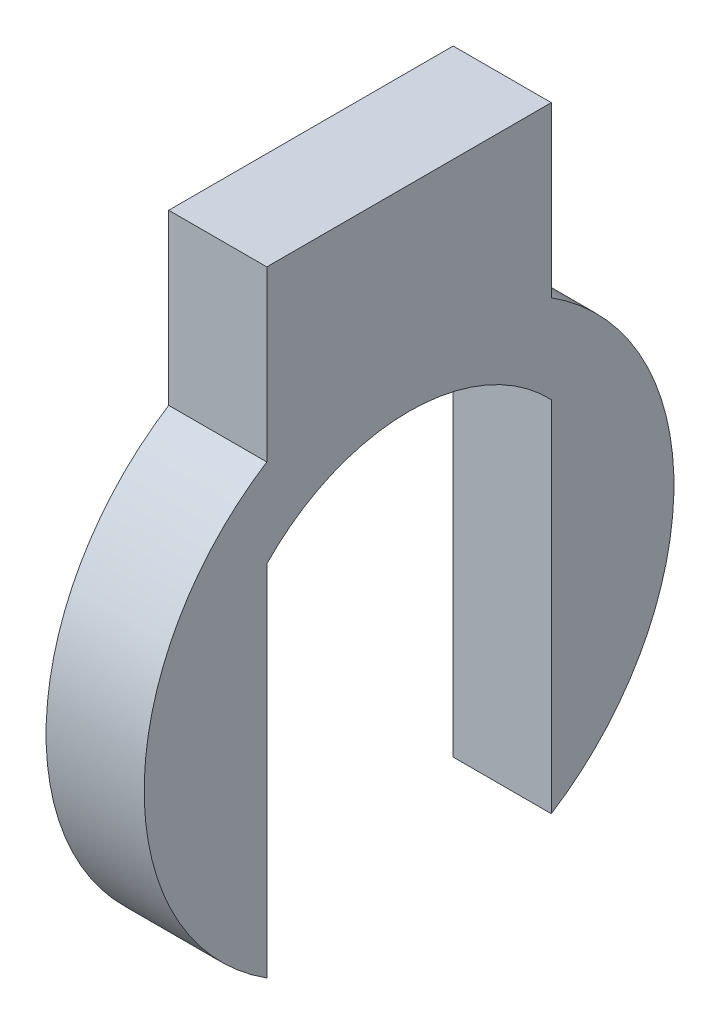
ISO-10303-21;
HEADER;
FILE_DESCRIPTION(('STEP AP214'),'2;1');
FILE_NAME('part.step','',(''),(''),'','','');
FILE_SCHEMA(('AUTOMOTIVE_DESIGN { 1 0 10303 214 1 1 1 1 }'));
ENDSEC;
DATA;
#1=APPLICATION_CONTEXT('core data for automotive mechanical design processes');
#2=APPLICATION_PROTOCOL_DEFINITION('international standard','automotive_design',2000,#1);
#3=PRODUCT_CONTEXT('',#1,'mechanical');
#4=PRODUCT('Part','Part','',(#3));
#5=PRODUCT_RELATED_PRODUCT_CATEGORY('part','',(#4));
#6=PRODUCT_DEFINITION_FORMATION('','',#4);
#7=PRODUCT_DEFINITION_CONTEXT('part definition',#1,'design');
#8=PRODUCT_DEFINITION('design','',#6,#7);
#9=PRODUCT_DEFINITION_SHAPE('','',#8);
#10=(LENGTH_UNIT() NAMED_UNIT(*) SI_UNIT(.MILLI.,.METRE.));
#11=(NAMED_UNIT(*) PLANE_ANGLE_UNIT() SI_UNIT($,.RADIAN.));
#12=(NAMED_UNIT(*) SI_UNIT($,.STERADIAN.) SOLID_ANGLE_UNIT());
#13=UNCERTAINTY_MEASURE_WITH_UNIT(LENGTH_MEASURE(1.E-05),#10,'distance_accuracy_value','');
#14=(GEOMETRIC_REPRESENTATION_CONTEXT(3) GLOBAL_UNCERTAINTY_ASSIGNED_CONTEXT((#13)) GLOBAL_UNIT_ASSIGNED_CONTEXT((#10,
#11,#12)) REPRESENTATION_CONTEXT('',''));
#15=CARTESIAN_POINT('',(0.,0.,0.));
#16=DIRECTION('',(0.,0.,1.));
#17=DIRECTION('',(1.,0.,0.));
#18=AXIS2_PLACEMENT_3D('',#15,#16,#17);
#19=CARTESIAN_POINT('',(2.54,0.,3.683));
#20=DIRECTION('',(0.,0.,1.));
#21=DIRECTION('',(1.,0.,0.));
#22=AXIS2_PLACEMENT_3D('',#19,#20,#21);
#23=PLANE('',#22);
#24=DIRECTION('',(0.,1.,0.));
#25=VECTOR('',#24,1.);
#26=CARTESIAN_POINT('',(0.,0.,3.683));
#27=LINE('',#26,#25);
#28=CARTESIAN_POINT('',(0.,-5.78512532275663,3.683));
#29=VERTEX_POINT('',#28);
#30=CARTESIAN_POINT('',(0.,3.4988442377448,3.683));
#31=VERTEX_POINT('',#30);
#32=EDGE_CURVE('E145',#29,#31,#27,.T.);
#33=ORIENTED_EDGE('',*,*,#32,.T.);
#34=DIRECTION('',(-1.,0.,0.));
#35=VECTOR('',#34,1.);
#36=CARTESIAN_POINT('',(2.54,3.4988442377448,3.683));
#37=LINE('',#36,#35);
#38=CARTESIAN_POINT('',(2.54,3.4988442377448,3.683));
#39=VERTEX_POINT('',#38);
#40=EDGE_CURVE('E11',#39,#31,#37,.T.);
#41=ORIENTED_EDGE('',*,*,#40,.F.);
#42=DIRECTION('',(0.,1.,0.));
#43=VECTOR('',#42,1.);
#44=CARTESIAN_POINT('',(2.54,0.,3.683));
#45=LINE('',#44,#43);
#46=CARTESIAN_POINT('',(2.54,-5.78512532275663,3.683));
#47=VERTEX_POINT('',#46);
#48=EDGE_CURVE('E100',#47,#39,#45,.T.);
#49=ORIENTED_EDGE('',*,*,#48,.F.);
#50=DIRECTION('',(-1.,0.,0.));
#51=VECTOR('',#50,1.);
#52=CARTESIAN_POINT('',(2.54,-5.78512532275663,3.683));
#53=LINE('',#52,#51);
#54=EDGE_CURVE('E141',#47,#29,#53,.T.);
#55=ORIENTED_EDGE('',*,*,#54,.T.);
#56=EDGE_LOOP('',(#33,#41,#49,#55));
#57=FACE_BOUND('',#56,.T.);
#58=ADVANCED_FACE('F47',(#57),#23,.F.);
#59=CARTESIAN_POINT('',(2.54,0.,0.));
#60=DIRECTION('',(-1.,0.,0.));
#61=DIRECTION('',(0.,0.,1.));
#62=AXIS2_PLACEMENT_3D('',#59,#60,#61);
#63=CYLINDRICAL_SURFACE('',#62,5.08);
#64=CARTESIAN_POINT('',(0.,0.,0.));
#65=DIRECTION('',(1.,0.,0.));
#66=DIRECTION('',(0.,0.,-1.));
#67=AXIS2_PLACEMENT_3D('',#64,#65,#66);
#68=CIRCLE('',#67,5.08);
#69=CARTESIAN_POINT('',(0.,3.4988442377448,-3.683));
#70=VERTEX_POINT('',#69);
#71=EDGE_CURVE('E149',#70,#31,#68,.T.);
#72=ORIENTED_EDGE('',*,*,#71,.F.);
#73=DIRECTION('',(-1.,0.,0.));
#74=VECTOR('',#73,1.);
#75=CARTESIAN_POINT('',(2.54,3.4988442377448,-3.683));
#76=LINE('',#75,#74);
#77=CARTESIAN_POINT('',(2.54,3.4988442377448,-3.683));
#78=VERTEX_POINT('',#77);
#79=EDGE_CURVE('E56',#78,#70,#76,.T.);
#80=ORIENTED_EDGE('',*,*,#79,.F.);
#81=CARTESIAN_POINT('',(2.54,0.,0.));
#82=DIRECTION('',(1.,0.,0.));
#83=DIRECTION('',(0.,0.,-1.));
#84=AXIS2_PLACEMENT_3D('',#81,#82,#83);
#85=CIRCLE('',#84,5.08);
#86=EDGE_CURVE('E212',#78,#39,#85,.T.);
#87=ORIENTED_EDGE('',*,*,#86,.T.);
#88=ORIENTED_EDGE('',*,*,#40,.T.);
#89=EDGE_LOOP('',(#72,#80,#87,#88));
#90=FACE_BOUND('',#89,.T.);
#91=ADVANCED_FACE('F193',(#90),#63,.F.);
#92=CARTESIAN_POINT('',(2.54,0.,-3.683));
#93=DIRECTION('',(0.,0.,1.));
#94=DIRECTION('',(1.,0.,0.));
#95=AXIS2_PLACEMENT_3D('',#92,#93,#94);
#96=PLANE('',#95);
#97=DIRECTION('',(0.,1.,0.));
#98=VECTOR('',#97,1.);
#99=CARTESIAN_POINT('',(0.,0.,-3.683));
#100=LINE('',#99,#98);
#101=CARTESIAN_POINT('',(0.,-5.78512532275663,-3.683));
#102=VERTEX_POINT('',#101);
#103=EDGE_CURVE('E153',#102,#70,#100,.T.);
#104=ORIENTED_EDGE('',*,*,#103,.F.);
#105=DIRECTION('',(-1.,0.,0.));
#106=VECTOR('',#105,1.);
#107=CARTESIAN_POINT('',(2.54,-5.78512532275663,-3.683));
#108=LINE('',#107,#106);
#109=CARTESIAN_POINT('',(2.54,-5.78512532275663,-3.683));
#110=VERTEX_POINT('',#109);
#111=EDGE_CURVE('E181',#110,#102,#108,.T.);
#112=ORIENTED_EDGE('',*,*,#111,.F.);
#113=DIRECTION('',(0.,1.,0.));
#114=VECTOR('',#113,1.);
#115=CARTESIAN_POINT('',(2.54,0.,-3.683));
#116=LINE('',#115,#114);
#117=EDGE_CURVE('E190',#110,#78,#116,.T.);
#118=ORIENTED_EDGE('',*,*,#117,.T.);
#119=ORIENTED_EDGE('',*,*,#79,.T.);
#120=EDGE_LOOP('',(#104,#112,#118,#119));
#121=FACE_BOUND('',#120,.T.);
#122=ADVANCED_FACE('F188',(#121),#96,.T.);
#123=CARTESIAN_POINT('',(2.54,0.,0.));
#124=DIRECTION('',(-1.,0.,0.));
#125=DIRECTION('',(0.,0.,1.));
#126=AXIS2_PLACEMENT_3D('',#123,#124,#125);
#127=CYLINDRICAL_SURFACE('',#126,6.858);
#128=CARTESIAN_POINT('',(0.,0.,0.));
#129=DIRECTION('',(1.,0.,0.));
#130=DIRECTION('',(0.,0.,-1.));
#131=AXIS2_PLACEMENT_3D('',#128,#129,#130);
#132=CIRCLE('',#131,6.858);
#133=CARTESIAN_POINT('',(0.,5.78512532275663,-3.683));
#134=VERTEX_POINT('',#133);
#135=EDGE_CURVE('E157',#102,#134,#132,.T.);
#136=ORIENTED_EDGE('',*,*,#135,.T.);
#137=DIRECTION('',(-1.,0.,0.));
#138=VECTOR('',#137,1.);
#139=CARTESIAN_POINT('',(2.54,5.78512532275663,-3.683));
#140=LINE('',#139,#138);
#141=CARTESIAN_POINT('',(2.54,5.78512532275663,-3.683));
#142=VERTEX_POINT('',#141);
#143=EDGE_CURVE('E177',#142,#134,#140,.T.);
#144=ORIENTED_EDGE('',*,*,#143,.F.);
#145=CARTESIAN_POINT('',(2.54,0.,0.));
#146=DIRECTION('',(1.,0.,0.));
#147=DIRECTION('',(0.,0.,-1.));
#148=AXIS2_PLACEMENT_3D('',#145,#146,#147);
#149=CIRCLE('',#148,6.858);
#150=EDGE_CURVE('E206',#110,#142,#149,.T.);
#151=ORIENTED_EDGE('',*,*,#150,.F.);
#152=ORIENTED_EDGE('',*,*,#111,.T.);
#153=EDGE_LOOP('',(#136,#144,#151,#152));
#154=FACE_BOUND('',#153,.T.);
#155=ADVANCED_FACE('F201',(#154),#127,.T.);
#156=CARTESIAN_POINT('',(2.54,0.,-3.683));
#157=DIRECTION('',(0.,0.,1.));
#158=DIRECTION('',(1.,0.,0.));
#159=AXIS2_PLACEMENT_3D('',#156,#157,#158);
#160=PLANE('',#159);
#161=DIRECTION('',(0.,1.,0.));
#162=VECTOR('',#161,1.);
#163=CARTESIAN_POINT('',(0.,0.,-3.683));
#164=LINE('',#163,#162);
#165=CARTESIAN_POINT('',(0.,10.16,-3.683));
#166=VERTEX_POINT('',#165);
#167=EDGE_CURVE('E160',#134,#166,#164,.T.);
#168=ORIENTED_EDGE('',*,*,#167,.T.);
#169=DIRECTION('',(-1.,0.,0.));
#170=VECTOR('',#169,1.);
#171=CARTESIAN_POINT('',(2.54,10.16,-3.683));
#172=LINE('',#171,#170);
#173=CARTESIAN_POINT('',(2.54,10.16,-3.683));
#174=VERTEX_POINT('',#173);
#175=EDGE_CURVE('E128',#174,#166,#172,.T.);
#176=ORIENTED_EDGE('',*,*,#175,.F.);
#177=DIRECTION('',(0.,1.,0.));
#178=VECTOR('',#177,1.);
#179=CARTESIAN_POINT('',(2.54,0.,-3.683));
#180=LINE('',#179,#178);
#181=EDGE_CURVE('E133',#142,#174,#180,.T.);
#182=ORIENTED_EDGE('',*,*,#181,.F.);
#183=ORIENTED_EDGE('',*,*,#143,.T.);
#184=EDGE_LOOP('',(#168,#176,#182,#183));
#185=FACE_BOUND('',#184,.T.);
#186=ADVANCED_FACE('F204',(#185),#160,.F.);
#187=CARTESIAN_POINT('',(2.54,10.16,0.));
#188=DIRECTION('',(0.,1.,0.));
#189=DIRECTION('',(0.,0.,1.));
#190=AXIS2_PLACEMENT_3D('',#187,#188,#189);
#191=PLANE('',#190);
#192=DIRECTION('',(0.,0.,-1.));
#193=VECTOR('',#192,1.);
#194=CARTESIAN_POINT('',(0.,10.16,0.));
#195=LINE('',#194,#193);
#196=CARTESIAN_POINT('',(0.,10.16,3.683));
#197=VERTEX_POINT('',#196);
#198=EDGE_CURVE('E122',#197,#166,#195,.T.);
#199=ORIENTED_EDGE('',*,*,#198,.F.);
#200=DIRECTION('',(-1.,0.,0.));
#201=VECTOR('',#200,1.);
#202=CARTESIAN_POINT('',(2.54,10.16,3.683));
#203=LINE('',#202,#201);
#204=CARTESIAN_POINT('',(2.54,10.16,3.683));
#205=VERTEX_POINT('',#204);
#206=EDGE_CURVE('E117',#205,#197,#203,.T.);
#207=ORIENTED_EDGE('',*,*,#206,.F.);
#208=DIRECTION('',(0.,0.,-1.));
#209=VECTOR('',#208,1.);
#210=CARTESIAN_POINT('',(2.54,10.16,0.));
#211=LINE('',#210,#209);
#212=EDGE_CURVE('E120',#205,#174,#211,.T.);
#213=ORIENTED_EDGE('',*,*,#212,.T.);
#214=ORIENTED_EDGE('',*,*,#175,.T.);
#215=EDGE_LOOP('',(#199,#207,#213,#214));
#216=FACE_BOUND('',#215,.T.);
#217=ADVANCED_FACE('F119',(#216),#191,.T.);
#218=CARTESIAN_POINT('',(2.54,0.,3.683));
#219=DIRECTION('',(0.,0.,1.));
#220=DIRECTION('',(1.,0.,0.));
#221=AXIS2_PLACEMENT_3D('',#218,#219,#220);
#222=PLANE('',#221);
#223=DIRECTION('',(0.,1.,0.));
#224=VECTOR('',#223,1.);
#225=CARTESIAN_POINT('',(0.,0.,3.683));
#226=LINE('',#225,#224);
#227=CARTESIAN_POINT('',(0.,5.78512532275663,3.683));
#228=VERTEX_POINT('',#227);
#229=EDGE_CURVE('E166',#228,#197,#226,.T.);
#230=ORIENTED_EDGE('',*,*,#229,.F.);
#231=DIRECTION('',(-1.,0.,0.));
#232=VECTOR('',#231,1.);
#233=CARTESIAN_POINT('',(2.54,5.78512532275663,3.683));
#234=LINE('',#233,#232);
#235=CARTESIAN_POINT('',(2.54,5.78512532275663,3.683));
#236=VERTEX_POINT('',#235);
#237=EDGE_CURVE('E91',#236,#228,#234,.T.);
#238=ORIENTED_EDGE('',*,*,#237,.F.);
#239=DIRECTION('',(0.,1.,0.));
#240=VECTOR('',#239,1.);
#241=CARTESIAN_POINT('',(2.54,0.,3.683));
#242=LINE('',#241,#240);
#243=EDGE_CURVE('E131',#236,#205,#242,.T.);
#244=ORIENTED_EDGE('',*,*,#243,.T.);
#245=ORIENTED_EDGE('',*,*,#206,.T.);
#246=EDGE_LOOP('',(#230,#238,#244,#245));
#247=FACE_BOUND('',#246,.T.);
#248=ADVANCED_FACE('F137',(#247),#222,.T.);
#249=CARTESIAN_POINT('',(2.54,0.,0.));
#250=DIRECTION('',(-1.,0.,0.));
#251=DIRECTION('',(0.,0.,1.));
#252=AXIS2_PLACEMENT_3D('',#249,#250,#251);
#253=CYLINDRICAL_SURFACE('',#252,6.858);
#254=CARTESIAN_POINT('',(0.,0.,0.));
#255=DIRECTION('',(1.,0.,0.));
#256=DIRECTION('',(0.,0.,-1.));
#257=AXIS2_PLACEMENT_3D('',#254,#255,#256);
#258=CIRCLE('',#257,6.858);
#259=EDGE_CURVE('E94',#228,#29,#258,.T.);
#260=ORIENTED_EDGE('',*,*,#259,.T.);
#261=ORIENTED_EDGE('',*,*,#54,.F.);
#262=CARTESIAN_POINT('',(2.54,0.,0.));
#263=DIRECTION('',(1.,0.,0.));
#264=DIRECTION('',(0.,0.,-1.));
#265=AXIS2_PLACEMENT_3D('',#262,#263,#264);
#266=CIRCLE('',#265,6.858);
#267=EDGE_CURVE('E64',#236,#47,#266,.T.);
#268=ORIENTED_EDGE('',*,*,#267,.F.);
#269=ORIENTED_EDGE('',*,*,#237,.T.);
#270=EDGE_LOOP('',(#260,#261,#268,#269));
#271=FACE_BOUND('',#270,.T.);
#272=ADVANCED_FACE('F217',(#271),#253,.T.);
#273=CARTESIAN_POINT('',(2.54,0.,0.));
#274=DIRECTION('',(1.,0.,0.));
#275=DIRECTION('',(0.,0.,-1.));
#276=AXIS2_PLACEMENT_3D('',#273,#274,#275);
#277=PLANE('',#276);
#278=ORIENTED_EDGE('',*,*,#48,.T.);
#279=ORIENTED_EDGE('',*,*,#86,.F.);
#280=ORIENTED_EDGE('',*,*,#117,.F.);
#281=ORIENTED_EDGE('',*,*,#150,.T.);
#282=ORIENTED_EDGE('',*,*,#181,.T.);
#283=ORIENTED_EDGE('',*,*,#212,.F.);
#284=ORIENTED_EDGE('',*,*,#243,.F.);
#285=ORIENTED_EDGE('',*,*,#267,.T.);
#286=EDGE_LOOP('',(#278,#279,#280,#281,#282,#283,#284,#285));
#287=FACE_BOUND('',#286,.T.);
#288=ADVANCED_FACE('F130',(#287),#277,.T.);
#289=CARTESIAN_POINT('',(0.,0.,0.));
#290=DIRECTION('',(1.,0.,0.));
#291=DIRECTION('',(0.,0.,-1.));
#292=AXIS2_PLACEMENT_3D('',#289,#290,#291);
#293=PLANE('',#292);
#294=ORIENTED_EDGE('',*,*,#32,.F.);
#295=ORIENTED_EDGE('',*,*,#259,.F.);
#296=ORIENTED_EDGE('',*,*,#229,.T.);
#297=ORIENTED_EDGE('',*,*,#198,.T.);
#298=ORIENTED_EDGE('',*,*,#167,.F.);
#299=ORIENTED_EDGE('',*,*,#135,.F.);
#300=ORIENTED_EDGE('',*,*,#103,.T.);
#301=ORIENTED_EDGE('',*,*,#71,.T.);
#302=EDGE_LOOP('',(#294,#295,#296,#297,#298,#299,#300,#301));
#303=FACE_BOUND('',#302,.T.);
#304=ADVANCED_FACE('F197',(#303),#293,.F.);
#305=CLOSED_SHELL('',(#58,#91,#122,#155,#186,#217,#248,#272,#288,#304));
#306=MANIFOLD_SOLID_BREP('B2',#305);
#307=ADVANCED_BREP_SHAPE_REPRESENTATION('',(#18,#306),#14);
#308=SHAPE_DEFINITION_REPRESENTATION(#9,#307);
ENDSEC;
END-ISO-10303-21;
